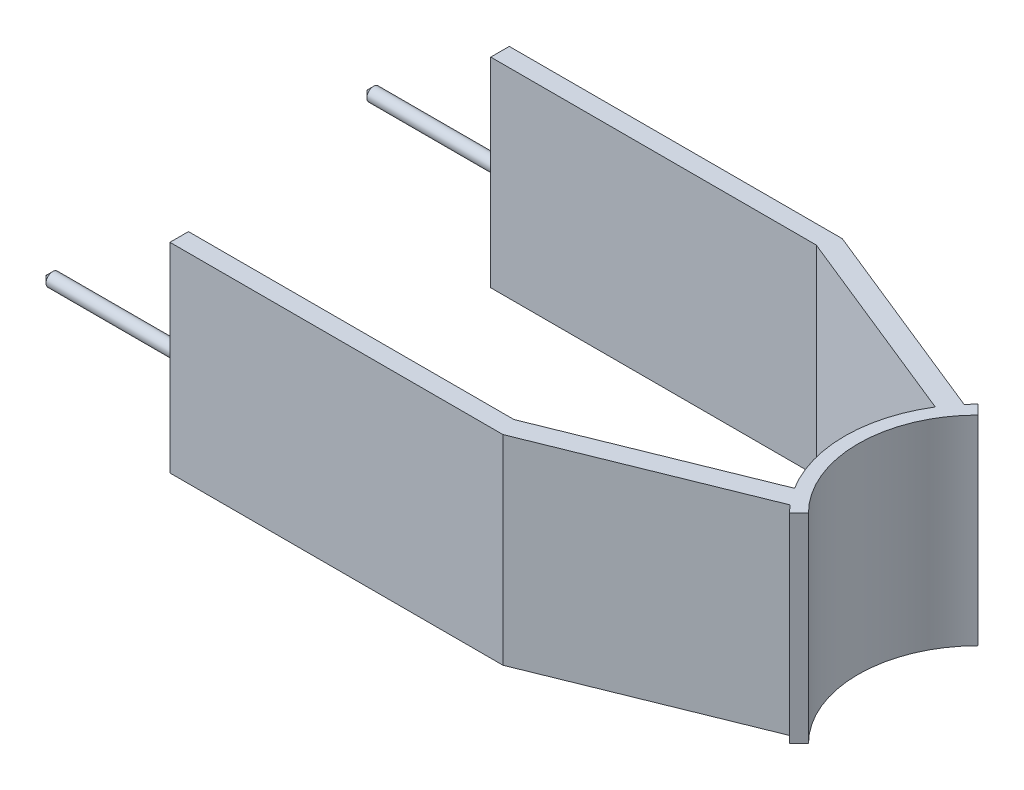
ISO-10303-21;
HEADER;
FILE_DESCRIPTION(('STEP AP214'),'2;1');
FILE_NAME('part.step','',(''),(''),'','','');
FILE_SCHEMA(('AUTOMOTIVE_DESIGN { 1 0 10303 214 1 1 1 1 }'));
ENDSEC;
DATA;
#1=APPLICATION_CONTEXT('core data for automotive mechanical design processes');
#2=APPLICATION_PROTOCOL_DEFINITION('international standard','automotive_design',2000,#1);
#3=PRODUCT_CONTEXT('',#1,'mechanical');
#4=PRODUCT('Part','Part','',(#3));
#5=PRODUCT_RELATED_PRODUCT_CATEGORY('part','',(#4));
#6=PRODUCT_DEFINITION_FORMATION('','',#4);
#7=PRODUCT_DEFINITION_CONTEXT('part definition',#1,'design');
#8=PRODUCT_DEFINITION('design','',#6,#7);
#9=PRODUCT_DEFINITION_SHAPE('','',#8);
#10=(LENGTH_UNIT() NAMED_UNIT(*) SI_UNIT(.MILLI.,.METRE.));
#11=(NAMED_UNIT(*) PLANE_ANGLE_UNIT() SI_UNIT($,.RADIAN.));
#12=(NAMED_UNIT(*) SI_UNIT($,.STERADIAN.) SOLID_ANGLE_UNIT());
#13=UNCERTAINTY_MEASURE_WITH_UNIT(LENGTH_MEASURE(1.E-05),#10,'distance_accuracy_value','');
#14=(GEOMETRIC_REPRESENTATION_CONTEXT(3) GLOBAL_UNCERTAINTY_ASSIGNED_CONTEXT((#13)) GLOBAL_UNIT_ASSIGNED_CONTEXT((#10,
#11,#12)) REPRESENTATION_CONTEXT('',''));
#15=CARTESIAN_POINT('',(0.,0.,0.));
#16=DIRECTION('',(0.,0.,1.));
#17=DIRECTION('',(1.,0.,0.));
#18=AXIS2_PLACEMENT_3D('',#15,#16,#17);
#19=CARTESIAN_POINT('',(0.,30.,0.));
#20=DIRECTION('',(0.,-1.,0.));
#21=DIRECTION('',(0.,0.,-1.));
#22=AXIS2_PLACEMENT_3D('',#19,#20,#21);
#23=CYLINDRICAL_SURFACE('',#22,20.);
#24=DIRECTION('',(0.,1.,0.));
#25=VECTOR('',#24,1.);
#26=CARTESIAN_POINT('',(-15.1449255872125,0.,13.0625889071729));
#27=LINE('',#26,#25);
#28=CARTESIAN_POINT('',(-15.1449255872125,0.,13.0625889071729));
#29=VERTEX_POINT('',#28);
#30=CARTESIAN_POINT('',(-15.1449255872125,30.,13.0625889071729));
#31=VERTEX_POINT('',#30);
#32=EDGE_CURVE('E181',#29,#31,#27,.T.);
#33=ORIENTED_EDGE('',*,*,#32,.F.);
#34=CARTESIAN_POINT('',(0.,0.,0.));
#35=DIRECTION('',(0.,1.,0.));
#36=DIRECTION('',(0.,0.,1.));
#37=AXIS2_PLACEMENT_3D('',#34,#35,#36);
#38=CIRCLE('',#37,20.);
#39=CARTESIAN_POINT('',(-14.142135623731,0.,14.1421356237309));
#40=VERTEX_POINT('',#39);
#41=EDGE_CURVE('E122',#29,#40,#38,.T.);
#42=ORIENTED_EDGE('',*,*,#41,.T.);
#43=DIRECTION('',(0.,-1.,0.));
#44=VECTOR('',#43,1.);
#45=CARTESIAN_POINT('',(-14.142135623731,30.,14.1421356237309));
#46=LINE('',#45,#44);
#47=CARTESIAN_POINT('',(-14.142135623731,30.,14.1421356237309));
#48=VERTEX_POINT('',#47);
#49=EDGE_CURVE('E107',#48,#40,#46,.T.);
#50=ORIENTED_EDGE('',*,*,#49,.F.);
#51=CARTESIAN_POINT('',(0.,30.,0.));
#52=DIRECTION('',(0.,1.,0.));
#53=DIRECTION('',(0.,0.,1.));
#54=AXIS2_PLACEMENT_3D('',#51,#52,#53);
#55=CIRCLE('',#54,20.);
#56=EDGE_CURVE('E136',#31,#48,#55,.T.);
#57=ORIENTED_EDGE('',*,*,#56,.F.);
#58=EDGE_LOOP('',(#33,#42,#50,#57));
#59=FACE_BOUND('',#58,.T.);
#60=ADVANCED_FACE('F49',(#59),#23,.T.);
#61=DIRECTION('',(0.,1.,0.));
#62=VECTOR('',#61,1.);
#63=CARTESIAN_POINT('',(-16.9796790719766,0.,10.5683725621629));
#64=LINE('',#63,#62);
#65=CARTESIAN_POINT('',(-16.9796790719766,0.,10.5683725621629));
#66=VERTEX_POINT('',#65);
#67=CARTESIAN_POINT('',(-16.9796790719766,30.,10.5683725621629));
#68=VERTEX_POINT('',#67);
#69=EDGE_CURVE('E189',#66,#68,#64,.T.);
#70=ORIENTED_EDGE('',*,*,#69,.T.);
#71=CARTESIAN_POINT('',(-16.9796790719765,30.,-10.5683725621631));
#72=VERTEX_POINT('',#71);
#73=EDGE_CURVE('E135',#72,#68,#55,.T.);
#74=ORIENTED_EDGE('',*,*,#73,.F.);
#75=DIRECTION('',(0.,1.,0.));
#76=VECTOR('',#75,1.);
#77=CARTESIAN_POINT('',(-16.9796790719765,0.,-10.5683725621631));
#78=LINE('',#77,#76);
#79=CARTESIAN_POINT('',(-16.9796790719765,0.,-10.5683725621631));
#80=VERTEX_POINT('',#79);
#81=EDGE_CURVE('E129',#80,#72,#78,.T.);
#82=ORIENTED_EDGE('',*,*,#81,.F.);
#83=EDGE_CURVE('E121',#80,#66,#38,.T.);
#84=ORIENTED_EDGE('',*,*,#83,.T.);
#85=EDGE_LOOP('',(#70,#74,#82,#84));
#86=FACE_BOUND('',#85,.T.);
#87=ADVANCED_FACE('F260',(#86),#23,.T.);
#88=CARTESIAN_POINT('',(0.,30.,0.));
#89=DIRECTION('',(0.,-1.,0.));
#90=DIRECTION('',(0.,0.,-1.));
#91=AXIS2_PLACEMENT_3D('',#88,#89,#90);
#92=CYLINDRICAL_SURFACE('',#91,18.);
#93=CARTESIAN_POINT('',(0.,0.,0.));
#94=DIRECTION('',(0.,-1.,0.));
#95=DIRECTION('',(0.,0.,1.));
#96=AXIS2_PLACEMENT_3D('',#93,#94,#95);
#97=CIRCLE('',#96,18.);
#98=CARTESIAN_POINT('',(-12.7279220613579,0.,12.7279220613578));
#99=VERTEX_POINT('',#98);
#100=CARTESIAN_POINT('',(-12.7279220613578,0.,-12.7279220613579));
#101=VERTEX_POINT('',#100);
#102=EDGE_CURVE('E126',#99,#101,#97,.T.);
#103=ORIENTED_EDGE('',*,*,#102,.T.);
#104=DIRECTION('',(0.,-1.,0.));
#105=VECTOR('',#104,1.);
#106=CARTESIAN_POINT('',(-12.7279220613578,30.,-12.7279220613579));
#107=LINE('',#106,#105);
#108=CARTESIAN_POINT('',(-12.7279220613578,30.,-12.7279220613579));
#109=VERTEX_POINT('',#108);
#110=EDGE_CURVE('E101',#109,#101,#107,.T.);
#111=ORIENTED_EDGE('',*,*,#110,.F.);
#112=CARTESIAN_POINT('',(0.,30.,0.));
#113=DIRECTION('',(0.,-1.,0.));
#114=DIRECTION('',(0.,0.,1.));
#115=AXIS2_PLACEMENT_3D('',#112,#113,#114);
#116=CIRCLE('',#115,18.);
#117=CARTESIAN_POINT('',(-12.7279220613579,30.,12.7279220613578));
#118=VERTEX_POINT('',#117);
#119=EDGE_CURVE('E117',#118,#109,#116,.T.);
#120=ORIENTED_EDGE('',*,*,#119,.F.);
#121=DIRECTION('',(0.,-1.,0.));
#122=VECTOR('',#121,1.);
#123=CARTESIAN_POINT('',(-12.7279220613579,30.,12.7279220613578));
#124=LINE('',#123,#122);
#125=EDGE_CURVE('E110',#118,#99,#124,.T.);
#126=ORIENTED_EDGE('',*,*,#125,.T.);
#127=EDGE_LOOP('',(#103,#111,#120,#126));
#128=FACE_BOUND('',#127,.T.);
#129=ADVANCED_FACE('F286',(#128),#92,.F.);
#130=CARTESIAN_POINT('',(-12.7279220613578,30.,-12.7279220613579));
#131=DIRECTION('',(-0.707106781186552,0.,0.707106781186543));
#132=DIRECTION('',(0.707106781186543,0.,0.707106781186552));
#133=AXIS2_PLACEMENT_3D('',#130,#131,#132);
#134=PLANE('',#133);
#135=DIRECTION('',(-0.707106781186543,0.,-0.707106781186552));
#136=VECTOR('',#135,1.);
#137=CARTESIAN_POINT('',(-12.7279220613578,0.,-12.7279220613579));
#138=LINE('',#137,#136);
#139=CARTESIAN_POINT('',(-14.1421356237309,0.,-14.142135623731));
#140=VERTEX_POINT('',#139);
#141=EDGE_CURVE('E123',#101,#140,#138,.T.);
#142=ORIENTED_EDGE('',*,*,#141,.T.);
#143=DIRECTION('',(0.,-1.,0.));
#144=VECTOR('',#143,1.);
#145=CARTESIAN_POINT('',(-14.1421356237309,30.,-14.142135623731));
#146=LINE('',#145,#144);
#147=CARTESIAN_POINT('',(-14.1421356237309,30.,-14.142135623731));
#148=VERTEX_POINT('',#147);
#149=EDGE_CURVE('E104',#148,#140,#146,.T.);
#150=ORIENTED_EDGE('',*,*,#149,.F.);
#151=DIRECTION('',(-0.707106781186543,0.,-0.707106781186552));
#152=VECTOR('',#151,1.);
#153=CARTESIAN_POINT('',(-12.7279220613578,30.,-12.7279220613579));
#154=LINE('',#153,#152);
#155=EDGE_CURVE('E137',#109,#148,#154,.T.);
#156=ORIENTED_EDGE('',*,*,#155,.F.);
#157=ORIENTED_EDGE('',*,*,#110,.T.);
#158=EDGE_LOOP('',(#142,#150,#156,#157));
#159=FACE_BOUND('',#158,.T.);
#160=ADVANCED_FACE('F346',(#159),#134,.F.);
#161=CARTESIAN_POINT('',(-15.1449255872123,0.,-13.0625889071731));
#162=VERTEX_POINT('',#161);
#163=EDGE_CURVE('E118',#140,#162,#38,.T.);
#164=ORIENTED_EDGE('',*,*,#163,.T.);
#165=DIRECTION('',(0.,1.,0.));
#166=VECTOR('',#165,1.);
#167=CARTESIAN_POINT('',(-15.1449255872123,0.,-13.0625889071731));
#168=LINE('',#167,#166);
#169=CARTESIAN_POINT('',(-15.1449255872123,30.,-13.0625889071731));
#170=VERTEX_POINT('',#169);
#171=EDGE_CURVE('E142',#162,#170,#168,.T.);
#172=ORIENTED_EDGE('',*,*,#171,.T.);
#173=EDGE_CURVE('E132',#148,#170,#55,.T.);
#174=ORIENTED_EDGE('',*,*,#173,.F.);
#175=ORIENTED_EDGE('',*,*,#149,.T.);
#176=EDGE_LOOP('',(#164,#172,#174,#175));
#177=FACE_BOUND('',#176,.T.);
#178=ADVANCED_FACE('F348',(#177),#23,.T.);
#179=CARTESIAN_POINT('',(-14.142135623731,30.,14.1421356237309));
#180=DIRECTION('',(-0.707106781186544,0.,-0.70710678118655));
#181=DIRECTION('',(-0.707106781186551,0.,0.707106781186545));
#182=AXIS2_PLACEMENT_3D('',#179,#180,#181);
#183=PLANE('',#182);
#184=DIRECTION('',(0.707106781186551,0.,-0.707106781186545));
#185=VECTOR('',#184,1.);
#186=CARTESIAN_POINT('',(-14.142135623731,0.,14.1421356237309));
#187=LINE('',#186,#185);
#188=EDGE_CURVE('E114',#40,#99,#187,.T.);
#189=ORIENTED_EDGE('',*,*,#188,.T.);
#190=ORIENTED_EDGE('',*,*,#125,.F.);
#191=DIRECTION('',(0.707106781186551,0.,-0.707106781186545));
#192=VECTOR('',#191,1.);
#193=CARTESIAN_POINT('',(-14.142135623731,30.,14.1421356237309));
#194=LINE('',#193,#192);
#195=EDGE_CURVE('E113',#48,#118,#194,.T.);
#196=ORIENTED_EDGE('',*,*,#195,.F.);
#197=ORIENTED_EDGE('',*,*,#49,.T.);
#198=EDGE_LOOP('',(#189,#190,#196,#197));
#199=FACE_BOUND('',#198,.T.);
#200=ADVANCED_FACE('F277',(#199),#183,.F.);
#201=CARTESIAN_POINT('',(0.,30.,0.));
#202=DIRECTION('',(0.,1.,0.));
#203=DIRECTION('',(0.,0.,1.));
#204=AXIS2_PLACEMENT_3D('',#201,#202,#203);
#205=PLANE('',#204);
#206=ORIENTED_EDGE('',*,*,#173,.T.);
#207=DIRECTION('',(-0.927138832738297,0.,-0.374718007078214));
#208=VECTOR('',#207,1.);
#209=CARTESIAN_POINT('',(-45.8555250507419,30.,-25.4747695006262));
#210=LINE('',#209,#208);
#211=CARTESIAN_POINT('',(-45.8555250507419,30.,-25.4747695006262));
#212=VERTEX_POINT('',#211);
#213=EDGE_CURVE('E157',#170,#212,#210,.T.);
#214=ORIENTED_EDGE('',*,*,#213,.T.);
#215=DIRECTION('',(-1.,0.,0.));
#216=VECTOR('',#215,1.);
#217=CARTESIAN_POINT('',(-45.8555250507419,30.,-25.4747695006262));
#218=LINE('',#217,#216);
#219=CARTESIAN_POINT('',(-95.8555250507419,30.,-25.4747695006262));
#220=VERTEX_POINT('',#219);
#221=EDGE_CURVE('E178',#212,#220,#218,.T.);
#222=ORIENTED_EDGE('',*,*,#221,.T.);
#223=DIRECTION('',(0.,0.,1.));
#224=VECTOR('',#223,1.);
#225=CARTESIAN_POINT('',(-95.8555250507419,30.,-22.6933530024113));
#226=LINE('',#225,#224);
#227=CARTESIAN_POINT('',(-95.8555250507419,30.,-22.6933530024113));
#228=VERTEX_POINT('',#227);
#229=EDGE_CURVE('E175',#220,#228,#226,.T.);
#230=ORIENTED_EDGE('',*,*,#229,.T.);
#231=DIRECTION('',(1.,0.,0.));
#232=VECTOR('',#231,1.);
#233=CARTESIAN_POINT('',(-46.9796790719765,30.,-22.6933530024113));
#234=LINE('',#233,#232);
#235=CARTESIAN_POINT('',(-46.9796790719765,30.,-22.6933530024113));
#236=VERTEX_POINT('',#235);
#237=EDGE_CURVE('E171',#228,#236,#234,.T.);
#238=ORIENTED_EDGE('',*,*,#237,.T.);
#239=DIRECTION('',(0.927138832738297,0.,0.374718007078214));
#240=VECTOR('',#239,1.);
#241=CARTESIAN_POINT('',(-16.9796790719765,30.,-10.5683725621631));
#242=LINE('',#241,#240);
#243=EDGE_CURVE('E154',#236,#72,#242,.T.);
#244=ORIENTED_EDGE('',*,*,#243,.T.);
#245=ORIENTED_EDGE('',*,*,#73,.T.);
#246=DIRECTION('',(0.927138832738301,0.,-0.374718007078203));
#247=VECTOR('',#246,1.);
#248=CARTESIAN_POINT('',(-16.9796790719766,30.,10.5683725621629));
#249=LINE('',#248,#247);
#250=CARTESIAN_POINT('',(-46.9796790719768,30.,22.6933530024108));
#251=VERTEX_POINT('',#250);
#252=EDGE_CURVE('E202',#251,#68,#249,.T.);
#253=ORIENTED_EDGE('',*,*,#252,.F.);
#254=DIRECTION('',(1.,0.,0.));
#255=VECTOR('',#254,1.);
#256=CARTESIAN_POINT('',(-46.9796790719768,30.,22.6933530024108));
#257=LINE('',#256,#255);
#258=CARTESIAN_POINT('',(-95.8555250507422,30.,22.6933530024103));
#259=VERTEX_POINT('',#258);
#260=EDGE_CURVE('E222',#259,#251,#257,.T.);
#261=ORIENTED_EDGE('',*,*,#260,.F.);
#262=DIRECTION('',(0.,0.,-1.));
#263=VECTOR('',#262,1.);
#264=CARTESIAN_POINT('',(-95.8555250507422,30.,22.6933530024103));
#265=LINE('',#264,#263);
#266=CARTESIAN_POINT('',(-95.8555250507422,30.,25.4747695006252));
#267=VERTEX_POINT('',#266);
#268=EDGE_CURVE('E220',#267,#259,#265,.T.);
#269=ORIENTED_EDGE('',*,*,#268,.F.);
#270=DIRECTION('',(-1.,0.,0.));
#271=VECTOR('',#270,1.);
#272=CARTESIAN_POINT('',(-45.8555250507422,30.,25.4747695006257));
#273=LINE('',#272,#271);
#274=CARTESIAN_POINT('',(-45.8555250507422,30.,25.4747695006257));
#275=VERTEX_POINT('',#274);
#276=EDGE_CURVE('E216',#275,#267,#273,.T.);
#277=ORIENTED_EDGE('',*,*,#276,.F.);
#278=DIRECTION('',(-0.927138832738301,0.,0.374718007078204));
#279=VECTOR('',#278,1.);
#280=CARTESIAN_POINT('',(-45.8555250507422,30.,25.4747695006257));
#281=LINE('',#280,#279);
#282=EDGE_CURVE('E67',#31,#275,#281,.T.);
#283=ORIENTED_EDGE('',*,*,#282,.F.);
#284=ORIENTED_EDGE('',*,*,#56,.T.);
#285=ORIENTED_EDGE('',*,*,#195,.T.);
#286=ORIENTED_EDGE('',*,*,#119,.T.);
#287=ORIENTED_EDGE('',*,*,#155,.T.);
#288=EDGE_LOOP('',(#206,#214,#222,#230,#238,#244,#245,#253,#261,#269,#277,#283,#284,#285,#286,#287));
#289=FACE_BOUND('',#288,.T.);
#290=ADVANCED_FACE('F342',(#289),#205,.T.);
#291=CARTESIAN_POINT('',(0.,0.,0.));
#292=DIRECTION('',(0.,1.,0.));
#293=DIRECTION('',(0.,0.,1.));
#294=AXIS2_PLACEMENT_3D('',#291,#292,#293);
#295=PLANE('',#294);
#296=ORIENTED_EDGE('',*,*,#83,.F.);
#297=DIRECTION('',(0.927138832738297,0.,0.374718007078214));
#298=VECTOR('',#297,1.);
#299=CARTESIAN_POINT('',(-16.9796790719765,0.,-10.5683725621631));
#300=LINE('',#299,#298);
#301=CARTESIAN_POINT('',(-46.9796790719765,0.,-22.6933530024113));
#302=VERTEX_POINT('',#301);
#303=EDGE_CURVE('E146',#302,#80,#300,.T.);
#304=ORIENTED_EDGE('',*,*,#303,.F.);
#305=DIRECTION('',(1.,0.,0.));
#306=VECTOR('',#305,1.);
#307=CARTESIAN_POINT('',(-46.9796790719765,0.,-22.6933530024113));
#308=LINE('',#307,#306);
#309=CARTESIAN_POINT('',(-95.8555250507419,0.,-22.6933530024113));
#310=VERTEX_POINT('',#309);
#311=EDGE_CURVE('E168',#310,#302,#308,.T.);
#312=ORIENTED_EDGE('',*,*,#311,.F.);
#313=DIRECTION('',(0.,0.,1.));
#314=VECTOR('',#313,1.);
#315=CARTESIAN_POINT('',(-95.8555250507419,0.,-22.6933530024113));
#316=LINE('',#315,#314);
#317=CARTESIAN_POINT('',(-95.8555250507419,0.,-25.4747695006262));
#318=VERTEX_POINT('',#317);
#319=EDGE_CURVE('E184',#318,#310,#316,.T.);
#320=ORIENTED_EDGE('',*,*,#319,.F.);
#321=DIRECTION('',(-1.,0.,0.));
#322=VECTOR('',#321,1.);
#323=CARTESIAN_POINT('',(-45.8555250507419,0.,-25.4747695006262));
#324=LINE('',#323,#322);
#325=CARTESIAN_POINT('',(-45.8555250507419,0.,-25.4747695006262));
#326=VERTEX_POINT('',#325);
#327=EDGE_CURVE('E174',#326,#318,#324,.T.);
#328=ORIENTED_EDGE('',*,*,#327,.F.);
#329=DIRECTION('',(-0.927138832738297,0.,-0.374718007078214));
#330=VECTOR('',#329,1.);
#331=CARTESIAN_POINT('',(-45.8555250507419,0.,-25.4747695006262));
#332=LINE('',#331,#330);
#333=EDGE_CURVE('E156',#162,#326,#332,.T.);
#334=ORIENTED_EDGE('',*,*,#333,.F.);
#335=ORIENTED_EDGE('',*,*,#163,.F.);
#336=ORIENTED_EDGE('',*,*,#141,.F.);
#337=ORIENTED_EDGE('',*,*,#102,.F.);
#338=ORIENTED_EDGE('',*,*,#188,.F.);
#339=ORIENTED_EDGE('',*,*,#41,.F.);
#340=DIRECTION('',(-0.927138832738301,0.,0.374718007078204));
#341=VECTOR('',#340,1.);
#342=CARTESIAN_POINT('',(-45.8555250507422,0.,25.4747695006257));
#343=LINE('',#342,#341);
#344=CARTESIAN_POINT('',(-45.8555250507422,0.,25.4747695006257));
#345=VERTEX_POINT('',#344);
#346=EDGE_CURVE('E193',#29,#345,#343,.T.);
#347=ORIENTED_EDGE('',*,*,#346,.T.);
#348=DIRECTION('',(-1.,0.,0.));
#349=VECTOR('',#348,1.);
#350=CARTESIAN_POINT('',(-45.8555250507422,0.,25.4747695006257));
#351=LINE('',#350,#349);
#352=CARTESIAN_POINT('',(-95.8555250507422,0.,25.4747695006252));
#353=VERTEX_POINT('',#352);
#354=EDGE_CURVE('E213',#345,#353,#351,.T.);
#355=ORIENTED_EDGE('',*,*,#354,.T.);
#356=DIRECTION('',(0.,0.,-1.));
#357=VECTOR('',#356,1.);
#358=CARTESIAN_POINT('',(-95.8555250507422,0.,22.6933530024103));
#359=LINE('',#358,#357);
#360=CARTESIAN_POINT('',(-95.8555250507422,0.,22.6933530024103));
#361=VERTEX_POINT('',#360);
#362=EDGE_CURVE('E227',#353,#361,#359,.T.);
#363=ORIENTED_EDGE('',*,*,#362,.T.);
#364=DIRECTION('',(1.,0.,0.));
#365=VECTOR('',#364,1.);
#366=CARTESIAN_POINT('',(-46.9796790719768,0.,22.6933530024108));
#367=LINE('',#366,#365);
#368=CARTESIAN_POINT('',(-46.9796790719768,0.,22.6933530024108));
#369=VERTEX_POINT('',#368);
#370=EDGE_CURVE('E219',#361,#369,#367,.T.);
#371=ORIENTED_EDGE('',*,*,#370,.T.);
#372=DIRECTION('',(0.927138832738301,0.,-0.374718007078203));
#373=VECTOR('',#372,1.);
#374=CARTESIAN_POINT('',(-16.9796790719766,0.,10.5683725621629));
#375=LINE('',#374,#373);
#376=EDGE_CURVE('E201',#369,#66,#375,.T.);
#377=ORIENTED_EDGE('',*,*,#376,.T.);
#378=EDGE_LOOP('',(#296,#304,#312,#320,#328,#334,#335,#336,#337,#338,#339,#347,#355,#363,#371,#377));
#379=FACE_BOUND('',#378,.T.);
#380=ADVANCED_FACE('F236',(#379),#295,.F.);
#381=CARTESIAN_POINT('',(-16.9796790719765,0.,-10.5683725621631));
#382=DIRECTION('',(-0.374718007078214,0.,0.927138832738297));
#383=DIRECTION('',(0.927138832738297,0.,0.374718007078214));
#384=AXIS2_PLACEMENT_3D('',#381,#382,#383);
#385=PLANE('',#384);
#386=ORIENTED_EDGE('',*,*,#243,.F.);
#387=DIRECTION('',(0.,1.,0.));
#388=VECTOR('',#387,1.);
#389=CARTESIAN_POINT('',(-46.9796790719765,0.,-22.6933530024113));
#390=LINE('',#389,#388);
#391=EDGE_CURVE('E149',#302,#236,#390,.T.);
#392=ORIENTED_EDGE('',*,*,#391,.F.);
#393=ORIENTED_EDGE('',*,*,#303,.T.);
#394=ORIENTED_EDGE('',*,*,#81,.T.);
#395=EDGE_LOOP('',(#386,#392,#393,#394));
#396=FACE_BOUND('',#395,.T.);
#397=ADVANCED_FACE('F365',(#396),#385,.T.);
#398=CARTESIAN_POINT('',(-45.8555250507419,0.,-25.4747695006262));
#399=DIRECTION('',(0.374718007078214,0.,-0.927138832738297));
#400=DIRECTION('',(-0.927138832738297,0.,-0.374718007078214));
#401=AXIS2_PLACEMENT_3D('',#398,#399,#400);
#402=PLANE('',#401);
#403=ORIENTED_EDGE('',*,*,#213,.F.);
#404=ORIENTED_EDGE('',*,*,#171,.F.);
#405=ORIENTED_EDGE('',*,*,#333,.T.);
#406=DIRECTION('',(0.,1.,0.));
#407=VECTOR('',#406,1.);
#408=CARTESIAN_POINT('',(-45.8555250507419,0.,-25.4747695006262));
#409=LINE('',#408,#407);
#410=EDGE_CURVE('E145',#326,#212,#409,.T.);
#411=ORIENTED_EDGE('',*,*,#410,.T.);
#412=EDGE_LOOP('',(#403,#404,#405,#411));
#413=FACE_BOUND('',#412,.T.);
#414=ADVANCED_FACE('F351',(#413),#402,.T.);
#415=CARTESIAN_POINT('',(-46.9796790719765,0.,-22.6933530024113));
#416=DIRECTION('',(0.,0.,1.));
#417=DIRECTION('',(1.,0.,0.));
#418=AXIS2_PLACEMENT_3D('',#415,#416,#417);
#419=PLANE('',#418);
#420=ORIENTED_EDGE('',*,*,#237,.F.);
#421=DIRECTION('',(0.,1.,0.));
#422=VECTOR('',#421,1.);
#423=CARTESIAN_POINT('',(-95.8555250507419,0.,-22.6933530024113));
#424=LINE('',#423,#422);
#425=EDGE_CURVE('E160',#310,#228,#424,.T.);
#426=ORIENTED_EDGE('',*,*,#425,.F.);
#427=ORIENTED_EDGE('',*,*,#311,.T.);
#428=ORIENTED_EDGE('',*,*,#391,.T.);
#429=EDGE_LOOP('',(#420,#426,#427,#428));
#430=FACE_BOUND('',#429,.T.);
#431=ADVANCED_FACE('F363',(#430),#419,.T.);
#432=CARTESIAN_POINT('',(-95.8555250507419,0.,-22.6933530024113));
#433=DIRECTION('',(-1.,0.,0.));
#434=DIRECTION('',(0.,0.,1.));
#435=AXIS2_PLACEMENT_3D('',#432,#433,#434);
#436=PLANE('',#435);
#437=CARTESIAN_POINT('',(-95.8555250507419,15.,-24.0840612515188));
#438=DIRECTION('',(-1.,0.,0.));
#439=DIRECTION('',(0.,0.,1.));
#440=AXIS2_PLACEMENT_3D('',#437,#438,#439);
#441=CIRCLE('',#440,1.);
#442=CARTESIAN_POINT('',(-95.8555250507419,15.,-23.0840612515188));
#443=VERTEX_POINT('',#442);
#444=EDGE_CURVE('E59',#443,#443,#441,.T.);
#445=ORIENTED_EDGE('',*,*,#444,.F.);
#446=EDGE_LOOP('',(#445));
#447=FACE_BOUND('',#446,.T.);
#448=ORIENTED_EDGE('',*,*,#229,.F.);
#449=DIRECTION('',(0.,1.,0.));
#450=VECTOR('',#449,1.);
#451=CARTESIAN_POINT('',(-95.8555250507419,0.,-25.4747695006262));
#452=LINE('',#451,#450);
#453=EDGE_CURVE('E165',#318,#220,#452,.T.);
#454=ORIENTED_EDGE('',*,*,#453,.F.);
#455=ORIENTED_EDGE('',*,*,#319,.T.);
#456=ORIENTED_EDGE('',*,*,#425,.T.);
#457=EDGE_LOOP('',(#448,#454,#455,#456));
#458=FACE_BOUND('',#457,.T.);
#459=ADVANCED_FACE('F428',(#447,#458),#436,.T.);
#460=CARTESIAN_POINT('',(-45.8555250507419,0.,-25.4747695006262));
#461=DIRECTION('',(0.,0.,-1.));
#462=DIRECTION('',(-1.,0.,0.));
#463=AXIS2_PLACEMENT_3D('',#460,#461,#462);
#464=PLANE('',#463);
#465=ORIENTED_EDGE('',*,*,#221,.F.);
#466=ORIENTED_EDGE('',*,*,#410,.F.);
#467=ORIENTED_EDGE('',*,*,#327,.T.);
#468=ORIENTED_EDGE('',*,*,#453,.T.);
#469=EDGE_LOOP('',(#465,#466,#467,#468));
#470=FACE_BOUND('',#469,.T.);
#471=ADVANCED_FACE('F358',(#470),#464,.T.);
#472=CARTESIAN_POINT('',(-45.8555250507422,0.,25.4747695006257));
#473=DIRECTION('',(-0.374718007078204,0.,-0.927138832738301));
#474=DIRECTION('',(-0.927138832738301,0.,0.374718007078204));
#475=AXIS2_PLACEMENT_3D('',#472,#473,#474);
#476=PLANE('',#475);
#477=ORIENTED_EDGE('',*,*,#282,.T.);
#478=DIRECTION('',(0.,1.,0.));
#479=VECTOR('',#478,1.);
#480=CARTESIAN_POINT('',(-45.8555250507422,0.,25.4747695006257));
#481=LINE('',#480,#479);
#482=EDGE_CURVE('E196',#345,#275,#481,.T.);
#483=ORIENTED_EDGE('',*,*,#482,.F.);
#484=ORIENTED_EDGE('',*,*,#346,.F.);
#485=ORIENTED_EDGE('',*,*,#32,.T.);
#486=EDGE_LOOP('',(#477,#483,#484,#485));
#487=FACE_BOUND('',#486,.T.);
#488=ADVANCED_FACE('F420',(#487),#476,.F.);
#489=CARTESIAN_POINT('',(-16.9796790719766,0.,10.5683725621629));
#490=DIRECTION('',(0.374718007078204,0.,0.927138832738301));
#491=DIRECTION('',(0.927138832738301,0.,-0.374718007078204));
#492=AXIS2_PLACEMENT_3D('',#489,#490,#491);
#493=PLANE('',#492);
#494=ORIENTED_EDGE('',*,*,#252,.T.);
#495=ORIENTED_EDGE('',*,*,#69,.F.);
#496=ORIENTED_EDGE('',*,*,#376,.F.);
#497=DIRECTION('',(0.,1.,0.));
#498=VECTOR('',#497,1.);
#499=CARTESIAN_POINT('',(-46.9796790719768,0.,22.6933530024108));
#500=LINE('',#499,#498);
#501=EDGE_CURVE('E192',#369,#251,#500,.T.);
#502=ORIENTED_EDGE('',*,*,#501,.T.);
#503=EDGE_LOOP('',(#494,#495,#496,#502));
#504=FACE_BOUND('',#503,.T.);
#505=ADVANCED_FACE('F251',(#504),#493,.F.);
#506=CARTESIAN_POINT('',(-45.8555250507422,0.,25.4747695006257));
#507=DIRECTION('',(0.,0.,-1.));
#508=DIRECTION('',(-1.,0.,0.));
#509=AXIS2_PLACEMENT_3D('',#506,#507,#508);
#510=PLANE('',#509);
#511=ORIENTED_EDGE('',*,*,#276,.T.);
#512=DIRECTION('',(0.,1.,0.));
#513=VECTOR('',#512,1.);
#514=CARTESIAN_POINT('',(-95.8555250507422,0.,25.4747695006252));
#515=LINE('',#514,#513);
#516=EDGE_CURVE('E205',#353,#267,#515,.T.);
#517=ORIENTED_EDGE('',*,*,#516,.F.);
#518=ORIENTED_EDGE('',*,*,#354,.F.);
#519=ORIENTED_EDGE('',*,*,#482,.T.);
#520=EDGE_LOOP('',(#511,#517,#518,#519));
#521=FACE_BOUND('',#520,.T.);
#522=ADVANCED_FACE('F338',(#521),#510,.F.);
#523=CARTESIAN_POINT('',(-95.8555250507422,0.,22.6933530024103));
#524=DIRECTION('',(1.,0.,0.));
#525=DIRECTION('',(0.,0.,-1.));
#526=AXIS2_PLACEMENT_3D('',#523,#524,#525);
#527=PLANE('',#526);
#528=CARTESIAN_POINT('',(-95.8555250507422,15.,24.0840612515177));
#529=DIRECTION('',(1.,0.,0.));
#530=DIRECTION('',(0.,0.,-1.));
#531=AXIS2_PLACEMENT_3D('',#528,#529,#530);
#532=CIRCLE('',#531,1.);
#533=CARTESIAN_POINT('',(-95.8555250507422,15.,23.0840612515177));
#534=VERTEX_POINT('',#533);
#535=EDGE_CURVE('E96',#534,#534,#532,.F.);
#536=ORIENTED_EDGE('',*,*,#535,.F.);
#537=EDGE_LOOP('',(#536));
#538=FACE_BOUND('',#537,.T.);
#539=ORIENTED_EDGE('',*,*,#268,.T.);
#540=DIRECTION('',(0.,1.,0.));
#541=VECTOR('',#540,1.);
#542=CARTESIAN_POINT('',(-95.8555250507422,0.,22.6933530024103));
#543=LINE('',#542,#541);
#544=EDGE_CURVE('E210',#361,#259,#543,.T.);
#545=ORIENTED_EDGE('',*,*,#544,.F.);
#546=ORIENTED_EDGE('',*,*,#362,.F.);
#547=ORIENTED_EDGE('',*,*,#516,.T.);
#548=EDGE_LOOP('',(#539,#545,#546,#547));
#549=FACE_BOUND('',#548,.T.);
#550=ADVANCED_FACE('F341',(#538,#549),#527,.F.);
#551=CARTESIAN_POINT('',(-46.9796790719768,0.,22.6933530024108));
#552=DIRECTION('',(0.,0.,1.));
#553=DIRECTION('',(1.,0.,0.));
#554=AXIS2_PLACEMENT_3D('',#551,#552,#553);
#555=PLANE('',#554);
#556=ORIENTED_EDGE('',*,*,#260,.T.);
#557=ORIENTED_EDGE('',*,*,#501,.F.);
#558=ORIENTED_EDGE('',*,*,#370,.F.);
#559=ORIENTED_EDGE('',*,*,#544,.T.);
#560=EDGE_LOOP('',(#556,#557,#558,#559));
#561=FACE_BOUND('',#560,.T.);
#562=ADVANCED_FACE('F246',(#561),#555,.F.);
#563=CARTESIAN_POINT('',(-115.855525050742,15.,24.0840612515175));
#564=DIRECTION('',(1.,0.,0.));
#565=DIRECTION('',(0.,0.,-1.));
#566=AXIS2_PLACEMENT_3D('',#563,#564,#565);
#567=CYLINDRICAL_SURFACE('',#566,1.);
#568=CARTESIAN_POINT('',(-114.855525050742,15.,24.0840612515175));
#569=DIRECTION('',(-1.,0.,0.));
#570=DIRECTION('',(0.,0.,1.));
#571=AXIS2_PLACEMENT_3D('',#568,#569,#570);
#572=CIRCLE('',#571,1.);
#573=CARTESIAN_POINT('',(-114.855525050742,15.,25.0840612515175));
#574=VERTEX_POINT('',#573);
#575=EDGE_CURVE('E94',#574,#574,#572,.F.);
#576=ORIENTED_EDGE('',*,*,#575,.T.);
#577=EDGE_LOOP('',(#576));
#578=FACE_BOUND('',#577,.T.);
#579=ORIENTED_EDGE('',*,*,#535,.T.);
#580=EDGE_LOOP('',(#579));
#581=FACE_BOUND('',#580,.T.);
#582=ADVANCED_FACE('F396',(#578,#581),#567,.T.);
#583=CARTESIAN_POINT('',(-114.855525050742,15.,24.0840612515175));
#584=DIRECTION('',(1.,0.,0.));
#585=DIRECTION('',(0.,0.,-1.));
#586=AXIS2_PLACEMENT_3D('',#583,#584,#585);
#587=CONICAL_SURFACE('',#586,1.,0.785398163397448);
#588=ORIENTED_EDGE('',*,*,#575,.F.);
#589=EDGE_LOOP('',(#588));
#590=FACE_BOUND('',#589,.T.);
#591=CARTESIAN_POINT('',(-115.855525050742,15.,24.0840612515175));
#592=VERTEX_POINT('',#591);
#593=VERTEX_LOOP('',#592);
#594=FACE_BOUND('',#593,.T.);
#595=ADVANCED_FACE('F89',(#590,#594),#587,.T.);
#596=CARTESIAN_POINT('',(-115.855525050742,15.,-24.0840612515188));
#597=DIRECTION('',(1.,0.,0.));
#598=DIRECTION('',(0.,0.,-1.));
#599=AXIS2_PLACEMENT_3D('',#596,#597,#598);
#600=CYLINDRICAL_SURFACE('',#599,1.);
#601=CARTESIAN_POINT('',(-114.855525050742,15.,-24.0840612515188));
#602=DIRECTION('',(-1.,0.,0.));
#603=DIRECTION('',(0.,0.,1.));
#604=AXIS2_PLACEMENT_3D('',#601,#602,#603);
#605=CIRCLE('',#604,1.);
#606=CARTESIAN_POINT('',(-114.855525050742,15.,-23.0840612515188));
#607=VERTEX_POINT('',#606);
#608=EDGE_CURVE('E11',#607,#607,#605,.F.);
#609=ORIENTED_EDGE('',*,*,#608,.T.);
#610=EDGE_LOOP('',(#609));
#611=FACE_BOUND('',#610,.T.);
#612=ORIENTED_EDGE('',*,*,#444,.T.);
#613=EDGE_LOOP('',(#612));
#614=FACE_BOUND('',#613,.T.);
#615=ADVANCED_FACE('F84',(#611,#614),#600,.T.);
#616=CARTESIAN_POINT('',(-114.855525050742,15.,-24.0840612515188));
#617=DIRECTION('',(1.,0.,0.));
#618=DIRECTION('',(0.,0.,-1.));
#619=AXIS2_PLACEMENT_3D('',#616,#617,#618);
#620=CONICAL_SURFACE('',#619,1.,0.785398163397448);
#621=CARTESIAN_POINT('',(-115.855525050742,15.,-24.0840612515188));
#622=VERTEX_POINT('',#621);
#623=VERTEX_LOOP('',#622);
#624=FACE_BOUND('',#623,.T.);
#625=ORIENTED_EDGE('',*,*,#608,.F.);
#626=EDGE_LOOP('',(#625));
#627=FACE_BOUND('',#626,.T.);
#628=ADVANCED_FACE('F52',(#624,#627),#620,.T.);
#629=CLOSED_SHELL('',(#60,#87,#129,#160,#178,#200,#290,#380,#397,#414,#431,#459,#471,#488,#505,
#522,#550,#562,#582,#595,#615,#628));
#630=MANIFOLD_SOLID_BREP('B2',#629);
#631=ADVANCED_BREP_SHAPE_REPRESENTATION('',(#18,#630),#14);
#632=SHAPE_DEFINITION_REPRESENTATION(#9,#631);
ENDSEC;
END-ISO-10303-21;
